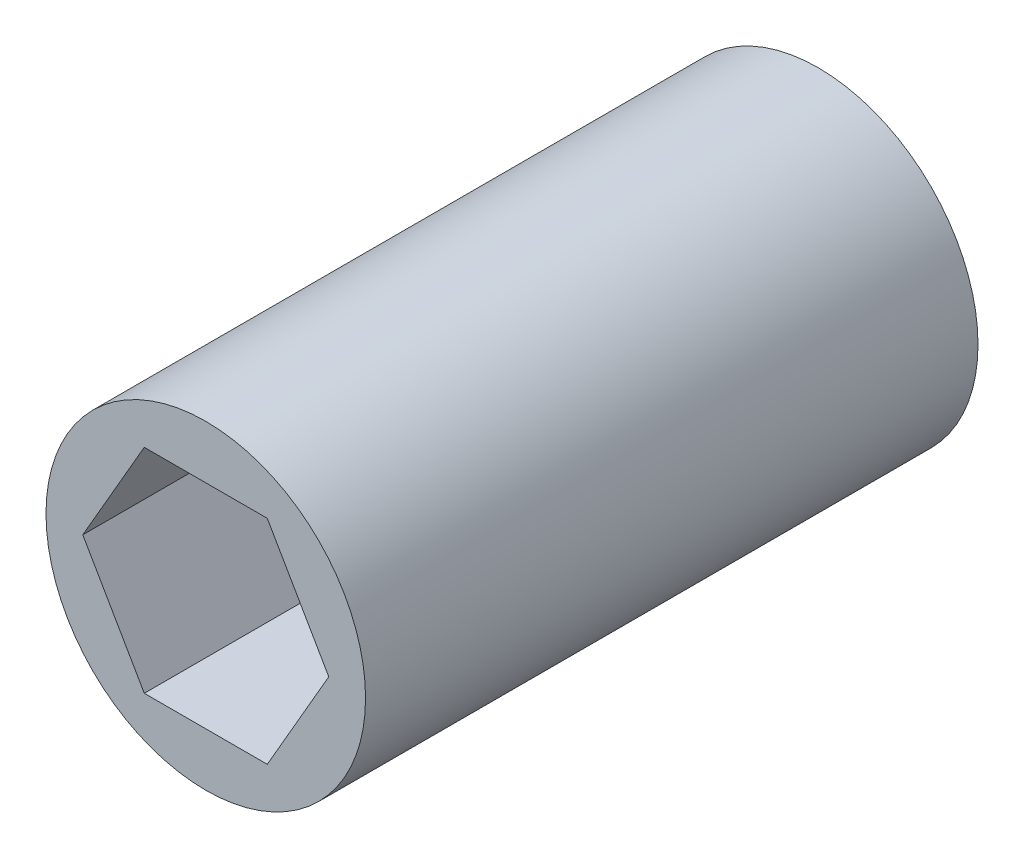
ISO-10303-21;
HEADER;
FILE_DESCRIPTION(('STEP AP214'),'2;1');
FILE_NAME('part.step','',(''),(''),'','','');
FILE_SCHEMA(('AUTOMOTIVE_DESIGN { 1 0 10303 214 1 1 1 1 }'));
ENDSEC;
DATA;
#1=APPLICATION_CONTEXT('core data for automotive mechanical design processes');
#2=APPLICATION_PROTOCOL_DEFINITION('international standard','automotive_design',2000,#1);
#3=PRODUCT_CONTEXT('',#1,'mechanical');
#4=PRODUCT('Part','Part','',(#3));
#5=PRODUCT_RELATED_PRODUCT_CATEGORY('part','',(#4));
#6=PRODUCT_DEFINITION_FORMATION('','',#4);
#7=PRODUCT_DEFINITION_CONTEXT('part definition',#1,'design');
#8=PRODUCT_DEFINITION('design','',#6,#7);
#9=PRODUCT_DEFINITION_SHAPE('','',#8);
#10=(LENGTH_UNIT() NAMED_UNIT(*) SI_UNIT(.MILLI.,.METRE.));
#11=(NAMED_UNIT(*) PLANE_ANGLE_UNIT() SI_UNIT($,.RADIAN.));
#12=(NAMED_UNIT(*) SI_UNIT($,.STERADIAN.) SOLID_ANGLE_UNIT());
#13=UNCERTAINTY_MEASURE_WITH_UNIT(LENGTH_MEASURE(1.E-05),#10,'distance_accuracy_value','');
#14=(GEOMETRIC_REPRESENTATION_CONTEXT(3) GLOBAL_UNCERTAINTY_ASSIGNED_CONTEXT((#13)) GLOBAL_UNIT_ASSIGNED_CONTEXT((#10,
#11,#12)) REPRESENTATION_CONTEXT('',''));
#15=CARTESIAN_POINT('',(0.,0.,0.));
#16=DIRECTION('',(0.,0.,1.));
#17=DIRECTION('',(1.,0.,0.));
#18=AXIS2_PLACEMENT_3D('',#15,#16,#17);
#19=CARTESIAN_POINT('',(0.,0.,18.25625));
#20=DIRECTION('',(0.,0.,1.));
#21=DIRECTION('',(1.,0.,0.));
#22=AXIS2_PLACEMENT_3D('',#19,#20,#21);
#23=PLANE('',#22);
#24=CARTESIAN_POINT('',(0.,0.,18.25625));
#25=DIRECTION('',(0.,0.,1.));
#26=DIRECTION('',(1.,0.,0.));
#27=AXIS2_PLACEMENT_3D('',#24,#25,#26);
#28=CIRCLE('',#27,9.525);
#29=CARTESIAN_POINT('',(9.525,0.,18.25625));
#30=VERTEX_POINT('',#29);
#31=EDGE_CURVE('E11',#30,#30,#28,.T.);
#32=ORIENTED_EDGE('',*,*,#31,.T.);
#33=EDGE_LOOP('',(#32));
#34=FACE_BOUND('',#33,.T.);
#35=DIRECTION('',(-0.500000000000001,0.866025403784438,0.));
#36=VECTOR('',#35,1.);
#37=CARTESIAN_POINT('',(7.33234841870824,0.,18.25625));
#38=LINE('',#37,#36);
#39=CARTESIAN_POINT('',(7.33234841870824,0.,18.25625));
#40=VERTEX_POINT('',#39);
#41=CARTESIAN_POINT('',(3.6661742093541,6.35,18.25625));
#42=VERTEX_POINT('',#41);
#43=EDGE_CURVE('E94',#40,#42,#38,.T.);
#44=ORIENTED_EDGE('',*,*,#43,.F.);
#45=DIRECTION('',(0.499999999999995,0.866025403784442,0.));
#46=VECTOR('',#45,1.);
#47=CARTESIAN_POINT('',(3.66617420935419,-6.34999999999995,18.25625));
#48=LINE('',#47,#46);
#49=CARTESIAN_POINT('',(3.66617420935419,-6.34999999999995,18.25625));
#50=VERTEX_POINT('',#49);
#51=EDGE_CURVE('E86',#50,#40,#48,.T.);
#52=ORIENTED_EDGE('',*,*,#51,.F.);
#53=DIRECTION('',(1.,0.,0.));
#54=VECTOR('',#53,1.);
#55=CARTESIAN_POINT('',(-3.66617420935406,-6.35000000000003,18.25625));
#56=LINE('',#55,#54);
#57=CARTESIAN_POINT('',(-3.66617420935406,-6.35000000000003,18.25625));
#58=VERTEX_POINT('',#57);
#59=EDGE_CURVE('E114',#58,#50,#56,.T.);
#60=ORIENTED_EDGE('',*,*,#59,.F.);
#61=DIRECTION('',(0.500000000000007,-0.866025403784435,0.));
#62=VECTOR('',#61,1.);
#63=CARTESIAN_POINT('',(-7.33234841870824,0.,18.25625));
#64=LINE('',#63,#62);
#65=CARTESIAN_POINT('',(-7.33234841870824,0.,18.25625));
#66=VERTEX_POINT('',#65);
#67=EDGE_CURVE('E112',#66,#58,#64,.T.);
#68=ORIENTED_EDGE('',*,*,#67,.F.);
#69=DIRECTION('',(-0.499999999999995,-0.866025403784442,0.));
#70=VECTOR('',#69,1.);
#71=CARTESIAN_POINT('',(-3.66617420935415,6.34999999999997,18.25625));
#72=LINE('',#71,#70);
#73=CARTESIAN_POINT('',(-3.66617420935415,6.34999999999997,18.25625));
#74=VERTEX_POINT('',#73);
#75=EDGE_CURVE('E108',#74,#66,#72,.T.);
#76=ORIENTED_EDGE('',*,*,#75,.F.);
#77=DIRECTION('',(-1.,0.,0.));
#78=VECTOR('',#77,1.);
#79=CARTESIAN_POINT('',(3.6661742093541,6.35,18.25625));
#80=LINE('',#79,#78);
#81=EDGE_CURVE('E106',#42,#74,#80,.T.);
#82=ORIENTED_EDGE('',*,*,#81,.F.);
#83=EDGE_LOOP('',(#44,#52,#60,#68,#76,#82));
#84=FACE_BOUND('',#83,.T.);
#85=ADVANCED_FACE('F33',(#34,#84),#23,.T.);
#86=CARTESIAN_POINT('',(0.,0.,-18.25625));
#87=DIRECTION('',(0.,0.,1.));
#88=DIRECTION('',(1.,0.,0.));
#89=AXIS2_PLACEMENT_3D('',#86,#87,#88);
#90=PLANE('',#89);
#91=CARTESIAN_POINT('',(0.,0.,-18.25625));
#92=DIRECTION('',(0.,0.,1.));
#93=DIRECTION('',(1.,0.,0.));
#94=AXIS2_PLACEMENT_3D('',#91,#92,#93);
#95=CIRCLE('',#94,9.525);
#96=CARTESIAN_POINT('',(9.525,0.,-18.25625));
#97=VERTEX_POINT('',#96);
#98=EDGE_CURVE('E37',#97,#97,#95,.T.);
#99=ORIENTED_EDGE('',*,*,#98,.F.);
#100=EDGE_LOOP('',(#99));
#101=FACE_BOUND('',#100,.T.);
#102=DIRECTION('',(0.499999999999995,0.866025403784442,0.));
#103=VECTOR('',#102,1.);
#104=CARTESIAN_POINT('',(3.66617420935419,-6.34999999999995,-18.25625));
#105=LINE('',#104,#103);
#106=CARTESIAN_POINT('',(3.66617420935419,-6.34999999999995,-18.25625));
#107=VERTEX_POINT('',#106);
#108=CARTESIAN_POINT('',(7.33234841870824,0.,-18.25625));
#109=VERTEX_POINT('',#108);
#110=EDGE_CURVE('E56',#107,#109,#105,.T.);
#111=ORIENTED_EDGE('',*,*,#110,.T.);
#112=DIRECTION('',(-0.500000000000001,0.866025403784438,0.));
#113=VECTOR('',#112,1.);
#114=CARTESIAN_POINT('',(7.33234841870824,0.,-18.25625));
#115=LINE('',#114,#113);
#116=CARTESIAN_POINT('',(3.6661742093541,6.35,-18.25625));
#117=VERTEX_POINT('',#116);
#118=EDGE_CURVE('E101',#109,#117,#115,.T.);
#119=ORIENTED_EDGE('',*,*,#118,.T.);
#120=DIRECTION('',(-1.,0.,0.));
#121=VECTOR('',#120,1.);
#122=CARTESIAN_POINT('',(3.6661742093541,6.35,-18.25625));
#123=LINE('',#122,#121);
#124=CARTESIAN_POINT('',(-3.66617420935415,6.34999999999997,-18.25625));
#125=VERTEX_POINT('',#124);
#126=EDGE_CURVE('E118',#117,#125,#123,.T.);
#127=ORIENTED_EDGE('',*,*,#126,.T.);
#128=DIRECTION('',(-0.499999999999995,-0.866025403784442,0.));
#129=VECTOR('',#128,1.);
#130=CARTESIAN_POINT('',(-3.66617420935415,6.34999999999997,-18.25625));
#131=LINE('',#130,#129);
#132=CARTESIAN_POINT('',(-7.33234841870824,0.,-18.25625));
#133=VERTEX_POINT('',#132);
#134=EDGE_CURVE('E121',#125,#133,#131,.T.);
#135=ORIENTED_EDGE('',*,*,#134,.T.);
#136=DIRECTION('',(0.500000000000007,-0.866025403784435,0.));
#137=VECTOR('',#136,1.);
#138=CARTESIAN_POINT('',(-7.33234841870824,0.,-18.25625));
#139=LINE('',#138,#137);
#140=CARTESIAN_POINT('',(-3.66617420935406,-6.35000000000003,-18.25625));
#141=VERTEX_POINT('',#140);
#142=EDGE_CURVE('E124',#133,#141,#139,.T.);
#143=ORIENTED_EDGE('',*,*,#142,.T.);
#144=DIRECTION('',(1.,0.,0.));
#145=VECTOR('',#144,1.);
#146=CARTESIAN_POINT('',(-3.66617420935406,-6.35000000000003,-18.25625));
#147=LINE('',#146,#145);
#148=EDGE_CURVE('E95',#141,#107,#147,.T.);
#149=ORIENTED_EDGE('',*,*,#148,.T.);
#150=EDGE_LOOP('',(#111,#119,#127,#135,#143,#149));
#151=FACE_BOUND('',#150,.T.);
#152=ADVANCED_FACE('F141',(#101,#151),#90,.F.);
#153=CARTESIAN_POINT('',(0.,0.,18.25625));
#154=DIRECTION('',(0.,0.,-1.));
#155=DIRECTION('',(-1.,0.,0.));
#156=AXIS2_PLACEMENT_3D('',#153,#154,#155);
#157=CYLINDRICAL_SURFACE('',#156,9.525);
#158=ORIENTED_EDGE('',*,*,#31,.F.);
#159=EDGE_LOOP('',(#158));
#160=FACE_BOUND('',#159,.T.);
#161=ORIENTED_EDGE('',*,*,#98,.T.);
#162=EDGE_LOOP('',(#161));
#163=FACE_BOUND('',#162,.T.);
#164=ADVANCED_FACE('F35',(#160,#163),#157,.T.);
#165=CARTESIAN_POINT('',(3.66617420935419,-6.34999999999995,18.25625));
#166=DIRECTION('',(-0.866025403784442,0.499999999999995,0.));
#167=DIRECTION('',(-0.499999999999995,-0.866025403784442,0.));
#168=AXIS2_PLACEMENT_3D('',#165,#166,#167);
#169=PLANE('',#168);
#170=ORIENTED_EDGE('',*,*,#110,.F.);
#171=DIRECTION('',(0.,0.,-1.));
#172=VECTOR('',#171,1.);
#173=CARTESIAN_POINT('',(3.66617420935419,-6.34999999999995,18.25625));
#174=LINE('',#173,#172);
#175=EDGE_CURVE('E90',#50,#107,#174,.T.);
#176=ORIENTED_EDGE('',*,*,#175,.F.);
#177=ORIENTED_EDGE('',*,*,#51,.T.);
#178=DIRECTION('',(0.,0.,-1.));
#179=VECTOR('',#178,1.);
#180=CARTESIAN_POINT('',(7.33234841870824,0.,18.25625));
#181=LINE('',#180,#179);
#182=EDGE_CURVE('E89',#40,#109,#181,.T.);
#183=ORIENTED_EDGE('',*,*,#182,.T.);
#184=EDGE_LOOP('',(#170,#176,#177,#183));
#185=FACE_BOUND('',#184,.T.);
#186=ADVANCED_FACE('F88',(#185),#169,.T.);
#187=CARTESIAN_POINT('',(7.33234841870824,0.,18.25625));
#188=DIRECTION('',(-0.866025403784438,-0.500000000000001,0.));
#189=DIRECTION('',(0.500000000000001,-0.866025403784438,0.));
#190=AXIS2_PLACEMENT_3D('',#187,#188,#189);
#191=PLANE('',#190);
#192=ORIENTED_EDGE('',*,*,#118,.F.);
#193=ORIENTED_EDGE('',*,*,#182,.F.);
#194=ORIENTED_EDGE('',*,*,#43,.T.);
#195=DIRECTION('',(0.,0.,-1.));
#196=VECTOR('',#195,1.);
#197=CARTESIAN_POINT('',(3.6661742093541,6.35,18.25625));
#198=LINE('',#197,#196);
#199=EDGE_CURVE('E102',#42,#117,#198,.T.);
#200=ORIENTED_EDGE('',*,*,#199,.T.);
#201=EDGE_LOOP('',(#192,#193,#194,#200));
#202=FACE_BOUND('',#201,.T.);
#203=ADVANCED_FACE('F98',(#202),#191,.T.);
#204=CARTESIAN_POINT('',(3.6661742093541,6.35,18.25625));
#205=DIRECTION('',(0.,-1.,0.));
#206=DIRECTION('',(1.,0.,0.));
#207=AXIS2_PLACEMENT_3D('',#204,#205,#206);
#208=PLANE('',#207);
#209=ORIENTED_EDGE('',*,*,#126,.F.);
#210=ORIENTED_EDGE('',*,*,#199,.F.);
#211=ORIENTED_EDGE('',*,*,#81,.T.);
#212=DIRECTION('',(0.,0.,-1.));
#213=VECTOR('',#212,1.);
#214=CARTESIAN_POINT('',(-3.66617420935415,6.34999999999997,18.25625));
#215=LINE('',#214,#213);
#216=EDGE_CURVE('E133',#74,#125,#215,.T.);
#217=ORIENTED_EDGE('',*,*,#216,.T.);
#218=EDGE_LOOP('',(#209,#210,#211,#217));
#219=FACE_BOUND('',#218,.T.);
#220=ADVANCED_FACE('F137',(#219),#208,.T.);
#221=CARTESIAN_POINT('',(-3.66617420935415,6.34999999999997,18.25625));
#222=DIRECTION('',(0.866025403784442,-0.499999999999995,0.));
#223=DIRECTION('',(0.499999999999995,0.866025403784441,0.));
#224=AXIS2_PLACEMENT_3D('',#221,#222,#223);
#225=PLANE('',#224);
#226=ORIENTED_EDGE('',*,*,#134,.F.);
#227=ORIENTED_EDGE('',*,*,#216,.F.);
#228=ORIENTED_EDGE('',*,*,#75,.T.);
#229=DIRECTION('',(0.,0.,-1.));
#230=VECTOR('',#229,1.);
#231=CARTESIAN_POINT('',(-7.33234841870824,0.,18.25625));
#232=LINE('',#231,#230);
#233=EDGE_CURVE('E131',#66,#133,#232,.T.);
#234=ORIENTED_EDGE('',*,*,#233,.T.);
#235=EDGE_LOOP('',(#226,#227,#228,#234));
#236=FACE_BOUND('',#235,.T.);
#237=ADVANCED_FACE('F149',(#236),#225,.T.);
#238=CARTESIAN_POINT('',(-7.33234841870824,0.,18.25625));
#239=DIRECTION('',(0.866025403784435,0.500000000000007,0.));
#240=DIRECTION('',(-0.500000000000007,0.866025403784435,0.));
#241=AXIS2_PLACEMENT_3D('',#238,#239,#240);
#242=PLANE('',#241);
#243=ORIENTED_EDGE('',*,*,#142,.F.);
#244=ORIENTED_EDGE('',*,*,#233,.F.);
#245=ORIENTED_EDGE('',*,*,#67,.T.);
#246=DIRECTION('',(0.,0.,-1.));
#247=VECTOR('',#246,1.);
#248=CARTESIAN_POINT('',(-3.66617420935406,-6.35000000000003,18.25625));
#249=LINE('',#248,#247);
#250=EDGE_CURVE('E48',#58,#141,#249,.T.);
#251=ORIENTED_EDGE('',*,*,#250,.T.);
#252=EDGE_LOOP('',(#243,#244,#245,#251));
#253=FACE_BOUND('',#252,.T.);
#254=ADVANCED_FACE('F147',(#253),#242,.T.);
#255=CARTESIAN_POINT('',(-3.66617420935406,-6.35000000000003,18.25625));
#256=DIRECTION('',(0.,1.,0.));
#257=DIRECTION('',(-1.,0.,0.));
#258=AXIS2_PLACEMENT_3D('',#255,#256,#257);
#259=PLANE('',#258);
#260=ORIENTED_EDGE('',*,*,#148,.F.);
#261=ORIENTED_EDGE('',*,*,#250,.F.);
#262=ORIENTED_EDGE('',*,*,#59,.T.);
#263=ORIENTED_EDGE('',*,*,#175,.T.);
#264=EDGE_LOOP('',(#260,#261,#262,#263));
#265=FACE_BOUND('',#264,.T.);
#266=ADVANCED_FACE('F143',(#265),#259,.T.);
#267=CLOSED_SHELL('',(#85,#152,#164,#186,#203,#220,#237,#254,#266));
#268=MANIFOLD_SOLID_BREP('B2',#267);
#269=ADVANCED_BREP_SHAPE_REPRESENTATION('',(#18,#268),#14);
#270=SHAPE_DEFINITION_REPRESENTATION(#9,#269);
ENDSEC;
END-ISO-10303-21;
